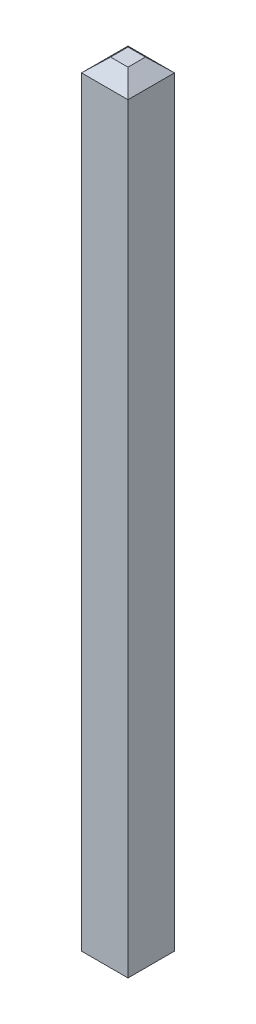
ISO-10303-21;
HEADER;
FILE_DESCRIPTION(('STEP AP214'),'2;1');
FILE_NAME('part.step','',(''),(''),'','','');
FILE_SCHEMA(('AUTOMOTIVE_DESIGN { 1 0 10303 214 1 1 1 1 }'));
ENDSEC;
DATA;
#1=APPLICATION_CONTEXT('core data for automotive mechanical design processes');
#2=APPLICATION_PROTOCOL_DEFINITION('international standard','automotive_design',2000,#1);
#3=PRODUCT_CONTEXT('',#1,'mechanical');
#4=PRODUCT('Part','Part','',(#3));
#5=PRODUCT_RELATED_PRODUCT_CATEGORY('part','',(#4));
#6=PRODUCT_DEFINITION_FORMATION('','',#4);
#7=PRODUCT_DEFINITION_CONTEXT('part definition',#1,'design');
#8=PRODUCT_DEFINITION('design','',#6,#7);
#9=PRODUCT_DEFINITION_SHAPE('','',#8);
#10=(LENGTH_UNIT() NAMED_UNIT(*) SI_UNIT(.MILLI.,.METRE.));
#11=(NAMED_UNIT(*) PLANE_ANGLE_UNIT() SI_UNIT($,.RADIAN.));
#12=(NAMED_UNIT(*) SI_UNIT($,.STERADIAN.) SOLID_ANGLE_UNIT());
#13=UNCERTAINTY_MEASURE_WITH_UNIT(LENGTH_MEASURE(1.E-05),#10,'distance_accuracy_value','');
#14=(GEOMETRIC_REPRESENTATION_CONTEXT(3) GLOBAL_UNCERTAINTY_ASSIGNED_CONTEXT((#13)) GLOBAL_UNIT_ASSIGNED_CONTEXT((#10,
#11,#12)) REPRESENTATION_CONTEXT('',''));
#15=CARTESIAN_POINT('',(0.,0.,0.));
#16=DIRECTION('',(0.,0.,1.));
#17=DIRECTION('',(1.,0.,0.));
#18=AXIS2_PLACEMENT_3D('',#15,#16,#17);
#19=CARTESIAN_POINT('',(5.24480000000001,-7.93710700303773,0.564535931288104));
#20=DIRECTION('',(0.,-0.728753063627172,-0.684776585649664));
#21=DIRECTION('',(0.,0.684776585649664,-0.728753063627172));
#22=AXIS2_PLACEMENT_3D('',#19,#20,#21);
#23=PLANE('',#22);
#24=DIRECTION('',(0.58895390545921,0.553413583578044,-0.588953905459206));
#25=VECTOR('',#24,1.);
#26=CARTESIAN_POINT('',(6.35000000000002,-8.54362065381016,1.21));
#27=LINE('',#26,#25);
#28=CARTESIAN_POINT('',(6.35000000000001,-8.54362065381015,1.21000000000001));
#29=VERTEX_POINT('',#28);
#30=CARTESIAN_POINT('',(6.55000000000001,-8.35568961932738,1.01000000000001));
#31=VERTEX_POINT('',#30);
#32=EDGE_CURVE('E92',#29,#31,#27,.T.);
#33=ORIENTED_EDGE('',*,*,#32,.F.);
#34=DIRECTION('',(1.,0.,0.));
#35=VECTOR('',#34,1.);
#36=CARTESIAN_POINT('',(6.9752,-8.54362065381015,1.21));
#37=LINE('',#36,#35);
#38=CARTESIAN_POINT('',(6.11000000000001,-8.54362065381014,1.21));
#39=VERTEX_POINT('',#38);
#40=EDGE_CURVE('E79',#39,#29,#37,.T.);
#41=ORIENTED_EDGE('',*,*,#40,.F.);
#42=DIRECTION('',(0.588953905459204,-0.553413583578044,0.588953905459212));
#43=VECTOR('',#42,1.);
#44=CARTESIAN_POINT('',(5.91000000000002,-8.35568961932738,1.01));
#45=LINE('',#44,#43);
#46=CARTESIAN_POINT('',(5.91000000000001,-8.35568961932738,1.01000000000001));
#47=VERTEX_POINT('',#46);
#48=EDGE_CURVE('E20',#47,#39,#45,.T.);
#49=ORIENTED_EDGE('',*,*,#48,.F.);
#50=DIRECTION('',(-1.,0.,0.));
#51=VECTOR('',#50,1.);
#52=CARTESIAN_POINT('',(7.2152,-8.35568961932739,1.01));
#53=LINE('',#52,#51);
#54=EDGE_CURVE('E103',#31,#47,#53,.T.);
#55=ORIENTED_EDGE('',*,*,#54,.F.);
#56=EDGE_LOOP('',(#33,#41,#49,#55));
#57=FACE_BOUND('',#56,.T.);
#58=ADVANCED_FACE('F17',(#57),#23,.T.);
#59=CARTESIAN_POINT('',(5.24480000000001,2.7185826521347,1.6554640687119));
#60=DIRECTION('',(0.,0.728753063627171,-0.684776585649664));
#61=DIRECTION('',(0.,0.684776585649664,0.728753063627171));
#62=AXIS2_PLACEMENT_3D('',#59,#60,#61);
#63=PLANE('',#62);
#64=DIRECTION('',(-0.588953905459174,-0.553413583578013,-0.588953905459272));
#65=VECTOR('',#64,1.);
#66=CARTESIAN_POINT('',(6.11000000000001,2.30000003584499,1.21));
#67=LINE('',#66,#65);
#68=CARTESIAN_POINT('',(6.11,2.30000003584502,1.20999999999998));
#69=VERTEX_POINT('',#68);
#70=CARTESIAN_POINT('',(5.91000000000002,2.11206900136229,1.01));
#71=VERTEX_POINT('',#70);
#72=EDGE_CURVE('E108',#69,#71,#67,.T.);
#73=ORIENTED_EDGE('',*,*,#72,.F.);
#74=DIRECTION('',(1.,0.,0.));
#75=VECTOR('',#74,1.);
#76=CARTESIAN_POINT('',(6.9752,2.300000035845,1.21));
#77=LINE('',#76,#75);
#78=CARTESIAN_POINT('',(6.35000000000003,2.30000003584503,1.20999999999999));
#79=VERTEX_POINT('',#78);
#80=EDGE_CURVE('E116',#79,#69,#77,.F.);
#81=ORIENTED_EDGE('',*,*,#80,.F.);
#82=DIRECTION('',(-0.588953905459178,0.553413583578018,0.588953905459263));
#83=VECTOR('',#82,1.);
#84=CARTESIAN_POINT('',(6.55000000000002,2.11206900136231,1.01));
#85=LINE('',#84,#83);
#86=CARTESIAN_POINT('',(6.55000000000001,2.11206900136231,1.01));
#87=VERTEX_POINT('',#86);
#88=EDGE_CURVE('E111',#87,#79,#85,.T.);
#89=ORIENTED_EDGE('',*,*,#88,.F.);
#90=DIRECTION('',(-1.,0.,0.));
#91=VECTOR('',#90,1.);
#92=CARTESIAN_POINT('',(7.2152,2.1120690013623,1.01));
#93=LINE('',#92,#91);
#94=EDGE_CURVE('E105',#71,#87,#93,.F.);
#95=ORIENTED_EDGE('',*,*,#94,.F.);
#96=EDGE_LOOP('',(#73,#81,#89,#95));
#97=FACE_BOUND('',#96,.T.);
#98=ADVANCED_FACE('F176',(#97),#63,.T.);
#99=CARTESIAN_POINT('',(5.46453593128811,-7.93710700303774,0.344800000000003));
#100=DIRECTION('',(-0.684776585649664,-0.728753063627171,0.));
#101=DIRECTION('',(0.728753063627171,-0.684776585649664,0.));
#102=AXIS2_PLACEMENT_3D('',#99,#100,#101);
#103=PLANE('',#102);
#104=DIRECTION('',(0.,0.,-1.));
#105=VECTOR('',#104,1.);
#106=CARTESIAN_POINT('',(6.11,-8.54362065381015,0.584800000000003));
#107=LINE('',#106,#105);
#108=CARTESIAN_POINT('',(6.11000000000001,-8.54362065381014,1.45));
#109=VERTEX_POINT('',#108);
#110=EDGE_CURVE('E85',#109,#39,#107,.T.);
#111=ORIENTED_EDGE('',*,*,#110,.F.);
#112=DIRECTION('',(0.588953905459186,-0.553413583578055,-0.588953905459219));
#113=VECTOR('',#112,1.);
#114=CARTESIAN_POINT('',(5.91000000000001,-8.3556896193274,1.65000000000001));
#115=LINE('',#114,#113);
#116=CARTESIAN_POINT('',(5.91000000000002,-8.35568961932738,1.65));
#117=VERTEX_POINT('',#116);
#118=EDGE_CURVE('E132',#117,#109,#115,.T.);
#119=ORIENTED_EDGE('',*,*,#118,.F.);
#120=DIRECTION('',(0.,0.,1.));
#121=VECTOR('',#120,1.);
#122=CARTESIAN_POINT('',(5.91000000000001,-8.35568961932739,2.3152));
#123=LINE('',#122,#121);
#124=EDGE_CURVE('E88',#47,#117,#123,.T.);
#125=ORIENTED_EDGE('',*,*,#124,.F.);
#126=ORIENTED_EDGE('',*,*,#48,.T.);
#127=EDGE_LOOP('',(#111,#119,#125,#126));
#128=FACE_BOUND('',#127,.T.);
#129=ADVANCED_FACE('F84',(#128),#103,.T.);
#130=CARTESIAN_POINT('',(6.9752,-8.54362065381015,0.584800000000003));
#131=DIRECTION('',(0.,-1.,0.));
#132=DIRECTION('',(0.,0.,-1.));
#133=AXIS2_PLACEMENT_3D('',#130,#131,#132);
#134=PLANE('',#133);
#135=ORIENTED_EDGE('',*,*,#110,.T.);
#136=ORIENTED_EDGE('',*,*,#40,.T.);
#137=DIRECTION('',(0.,0.,1.));
#138=VECTOR('',#137,1.);
#139=CARTESIAN_POINT('',(6.35000000000002,-8.54362065381016,0.344800000000003));
#140=LINE('',#139,#138);
#141=CARTESIAN_POINT('',(6.35000000000002,-8.54362065381016,1.45));
#142=VERTEX_POINT('',#141);
#143=EDGE_CURVE('E94',#142,#29,#140,.F.);
#144=ORIENTED_EDGE('',*,*,#143,.F.);
#145=DIRECTION('',(1.,0.,0.));
#146=VECTOR('',#145,1.);
#147=CARTESIAN_POINT('',(5.24480000000001,-8.54362065381016,1.45000000000001));
#148=LINE('',#147,#146);
#149=EDGE_CURVE('E98',#109,#142,#148,.T.);
#150=ORIENTED_EDGE('',*,*,#149,.F.);
#151=EDGE_LOOP('',(#135,#136,#144,#150));
#152=FACE_BOUND('',#151,.T.);
#153=ADVANCED_FACE('F96',(#152),#134,.T.);
#154=CARTESIAN_POINT('',(5.90453593128811,-8.9622032700998,0.344800000000003));
#155=DIRECTION('',(0.684776585649664,-0.728753063627171,0.));
#156=DIRECTION('',(0.728753063627171,0.684776585649664,0.));
#157=AXIS2_PLACEMENT_3D('',#154,#155,#156);
#158=PLANE('',#157);
#159=DIRECTION('',(0.,0.,-1.));
#160=VECTOR('',#159,1.);
#161=CARTESIAN_POINT('',(6.55000000000001,-8.35568961932739,2.3152));
#162=LINE('',#161,#160);
#163=CARTESIAN_POINT('',(6.55000000000002,-8.3556896193274,1.65));
#164=VERTEX_POINT('',#163);
#165=EDGE_CURVE('E135',#164,#31,#162,.T.);
#166=ORIENTED_EDGE('',*,*,#165,.F.);
#167=DIRECTION('',(0.588953905459204,0.553413583578046,0.58895390545921));
#168=VECTOR('',#167,1.);
#169=CARTESIAN_POINT('',(6.35000000000001,-8.54362065381016,1.45000000000001));
#170=LINE('',#169,#168);
#171=EDGE_CURVE('E129',#142,#164,#170,.T.);
#172=ORIENTED_EDGE('',*,*,#171,.F.);
#173=ORIENTED_EDGE('',*,*,#143,.T.);
#174=ORIENTED_EDGE('',*,*,#32,.T.);
#175=EDGE_LOOP('',(#166,#172,#173,#174));
#176=FACE_BOUND('',#175,.T.);
#177=ADVANCED_FACE('F186',(#176),#158,.T.);
#178=CARTESIAN_POINT('',(7.2152,3.1599724496381,1.01));
#179=DIRECTION('',(0.,0.,-1.));
#180=DIRECTION('',(-1.,0.,0.));
#181=AXIS2_PLACEMENT_3D('',#178,#179,#180);
#182=PLANE('',#181);
#183=DIRECTION('',(0.,1.,0.));
#184=VECTOR('',#183,1.);
#185=CARTESIAN_POINT('',(5.91000000000001,3.1599724496381,1.01));
#186=LINE('',#185,#184);
#187=EDGE_CURVE('E126',#71,#47,#186,.F.);
#188=ORIENTED_EDGE('',*,*,#187,.F.);
#189=ORIENTED_EDGE('',*,*,#94,.T.);
#190=DIRECTION('',(0.,1.,0.));
#191=VECTOR('',#190,1.);
#192=CARTESIAN_POINT('',(6.55000000000001,-9.40359306760325,1.01));
#193=LINE('',#192,#191);
#194=EDGE_CURVE('E138',#31,#87,#193,.T.);
#195=ORIENTED_EDGE('',*,*,#194,.F.);
#196=ORIENTED_EDGE('',*,*,#54,.T.);
#197=EDGE_LOOP('',(#188,#189,#195,#196));
#198=FACE_BOUND('',#197,.T.);
#199=ADVANCED_FACE('F179',(#198),#182,.T.);
#200=CARTESIAN_POINT('',(5.46453593128811,1.6934863850726,2.3152));
#201=DIRECTION('',(-0.684776585649665,0.72875306362717,0.));
#202=DIRECTION('',(-0.72875306362717,-0.684776585649665,0.));
#203=AXIS2_PLACEMENT_3D('',#200,#201,#202);
#204=PLANE('',#203);
#205=DIRECTION('',(0.,0.,1.));
#206=VECTOR('',#205,1.);
#207=CARTESIAN_POINT('',(6.11,2.300000035845,2.0752));
#208=LINE('',#207,#206);
#209=CARTESIAN_POINT('',(6.11000000000001,2.30000003584499,1.45));
#210=VERTEX_POINT('',#209);
#211=EDGE_CURVE('E119',#69,#210,#208,.T.);
#212=ORIENTED_EDGE('',*,*,#211,.F.);
#213=ORIENTED_EDGE('',*,*,#72,.T.);
#214=DIRECTION('',(0.,0.,1.));
#215=VECTOR('',#214,1.);
#216=CARTESIAN_POINT('',(5.91000000000001,2.1120690013623,2.3152));
#217=LINE('',#216,#215);
#218=CARTESIAN_POINT('',(5.91000000000003,2.11206900136228,1.65));
#219=VERTEX_POINT('',#218);
#220=EDGE_CURVE('E123',#219,#71,#217,.F.);
#221=ORIENTED_EDGE('',*,*,#220,.F.);
#222=DIRECTION('',(-0.588953905459245,-0.553413583578025,0.588953905459189));
#223=VECTOR('',#222,1.);
#224=CARTESIAN_POINT('',(6.11,2.30000003584499,1.44999999999999));
#225=LINE('',#224,#223);
#226=EDGE_CURVE('E143',#210,#219,#225,.T.);
#227=ORIENTED_EDGE('',*,*,#226,.F.);
#228=EDGE_LOOP('',(#212,#213,#221,#227));
#229=FACE_BOUND('',#228,.T.);
#230=ADVANCED_FACE('F170',(#229),#204,.T.);
#231=CARTESIAN_POINT('',(5.90453593128811,2.7185826521347,2.3152));
#232=DIRECTION('',(0.684776585649666,0.72875306362717,0.));
#233=DIRECTION('',(-0.72875306362717,0.684776585649666,0.));
#234=AXIS2_PLACEMENT_3D('',#231,#232,#233);
#235=PLANE('',#234);
#236=DIRECTION('',(0.,0.,-1.));
#237=VECTOR('',#236,1.);
#238=CARTESIAN_POINT('',(6.55000000000001,2.1120690013623,2.3152));
#239=LINE('',#238,#237);
#240=CARTESIAN_POINT('',(6.55000000000001,2.1120690013623,1.65));
#241=VERTEX_POINT('',#240);
#242=EDGE_CURVE('E141',#87,#241,#239,.F.);
#243=ORIENTED_EDGE('',*,*,#242,.F.);
#244=ORIENTED_EDGE('',*,*,#88,.T.);
#245=DIRECTION('',(0.,0.,1.));
#246=VECTOR('',#245,1.);
#247=CARTESIAN_POINT('',(6.35000000000001,2.300000035845,2.0752));
#248=LINE('',#247,#246);
#249=CARTESIAN_POINT('',(6.35000000000003,2.30000003584502,1.45));
#250=VERTEX_POINT('',#249);
#251=EDGE_CURVE('E113',#250,#79,#248,.F.);
#252=ORIENTED_EDGE('',*,*,#251,.F.);
#253=DIRECTION('',(-0.588953905459263,0.553413583578016,-0.588953905459179));
#254=VECTOR('',#253,1.);
#255=CARTESIAN_POINT('',(6.55000000000001,2.11206900136226,1.64999999999996));
#256=LINE('',#255,#254);
#257=EDGE_CURVE('E35',#241,#250,#256,.T.);
#258=ORIENTED_EDGE('',*,*,#257,.F.);
#259=EDGE_LOOP('',(#243,#244,#252,#258));
#260=FACE_BOUND('',#259,.T.);
#261=ADVANCED_FACE('F211',(#260),#235,.T.);
#262=CARTESIAN_POINT('',(6.9752,2.300000035845,2.0752));
#263=DIRECTION('',(0.,1.,0.));
#264=DIRECTION('',(0.,0.,1.));
#265=AXIS2_PLACEMENT_3D('',#262,#263,#264);
#266=PLANE('',#265);
#267=ORIENTED_EDGE('',*,*,#211,.T.);
#268=DIRECTION('',(1.,0.,0.));
#269=VECTOR('',#268,1.);
#270=CARTESIAN_POINT('',(5.24480000000001,2.30000003584499,1.44999999999999));
#271=LINE('',#270,#269);
#272=EDGE_CURVE('E147',#250,#210,#271,.F.);
#273=ORIENTED_EDGE('',*,*,#272,.F.);
#274=ORIENTED_EDGE('',*,*,#251,.T.);
#275=ORIENTED_EDGE('',*,*,#80,.T.);
#276=EDGE_LOOP('',(#267,#273,#274,#275));
#277=FACE_BOUND('',#276,.T.);
#278=ADVANCED_FACE('F173',(#277),#266,.T.);
#279=CARTESIAN_POINT('',(5.91000000000001,3.1599724496381,2.3152));
#280=DIRECTION('',(-1.,0.,0.));
#281=DIRECTION('',(0.,0.,1.));
#282=AXIS2_PLACEMENT_3D('',#279,#280,#281);
#283=PLANE('',#282);
#284=ORIENTED_EDGE('',*,*,#220,.T.);
#285=ORIENTED_EDGE('',*,*,#187,.T.);
#286=ORIENTED_EDGE('',*,*,#124,.T.);
#287=DIRECTION('',(0.,1.,0.));
#288=VECTOR('',#287,1.);
#289=CARTESIAN_POINT('',(5.91000000000001,-9.40359306760325,1.65));
#290=LINE('',#289,#288);
#291=EDGE_CURVE('E150',#219,#117,#290,.F.);
#292=ORIENTED_EDGE('',*,*,#291,.F.);
#293=EDGE_LOOP('',(#284,#285,#286,#292));
#294=FACE_BOUND('',#293,.T.);
#295=ADVANCED_FACE('F181',(#294),#283,.T.);
#296=CARTESIAN_POINT('',(5.24480000000001,-8.9622032700998,1.0045359312881));
#297=DIRECTION('',(0.,-0.728753063627172,0.684776585649664));
#298=DIRECTION('',(0.,-0.684776585649664,-0.728753063627172));
#299=AXIS2_PLACEMENT_3D('',#296,#297,#298);
#300=PLANE('',#299);
#301=ORIENTED_EDGE('',*,*,#118,.T.);
#302=ORIENTED_EDGE('',*,*,#149,.T.);
#303=ORIENTED_EDGE('',*,*,#171,.T.);
#304=DIRECTION('',(1.,0.,0.));
#305=VECTOR('',#304,1.);
#306=CARTESIAN_POINT('',(7.2152,-8.35568961932739,1.65));
#307=LINE('',#306,#305);
#308=EDGE_CURVE('E153',#117,#164,#307,.T.);
#309=ORIENTED_EDGE('',*,*,#308,.F.);
#310=EDGE_LOOP('',(#301,#302,#303,#309));
#311=FACE_BOUND('',#310,.T.);
#312=ADVANCED_FACE('F183',(#311),#300,.T.);
#313=CARTESIAN_POINT('',(6.55000000000001,-9.40359306760325,2.3152));
#314=DIRECTION('',(1.,0.,0.));
#315=DIRECTION('',(0.,0.,-1.));
#316=AXIS2_PLACEMENT_3D('',#313,#314,#315);
#317=PLANE('',#316);
#318=ORIENTED_EDGE('',*,*,#242,.T.);
#319=DIRECTION('',(0.,1.,0.));
#320=VECTOR('',#319,1.);
#321=CARTESIAN_POINT('',(6.55000000000001,-9.40359306760325,1.65));
#322=LINE('',#321,#320);
#323=EDGE_CURVE('E26',#164,#241,#322,.T.);
#324=ORIENTED_EDGE('',*,*,#323,.F.);
#325=ORIENTED_EDGE('',*,*,#165,.T.);
#326=ORIENTED_EDGE('',*,*,#194,.T.);
#327=EDGE_LOOP('',(#318,#324,#325,#326));
#328=FACE_BOUND('',#327,.T.);
#329=ADVANCED_FACE('F163',(#328),#317,.T.);
#330=CARTESIAN_POINT('',(5.24480000000001,1.6934863850726,2.0954640687119));
#331=DIRECTION('',(0.,0.728753063627172,0.684776585649663));
#332=DIRECTION('',(0.,-0.684776585649663,0.728753063627172));
#333=AXIS2_PLACEMENT_3D('',#330,#331,#332);
#334=PLANE('',#333);
#335=ORIENTED_EDGE('',*,*,#257,.T.);
#336=ORIENTED_EDGE('',*,*,#272,.T.);
#337=ORIENTED_EDGE('',*,*,#226,.T.);
#338=DIRECTION('',(1.,0.,0.));
#339=VECTOR('',#338,1.);
#340=CARTESIAN_POINT('',(7.2152,2.1120690013623,1.65));
#341=LINE('',#340,#339);
#342=EDGE_CURVE('E11',#241,#219,#341,.F.);
#343=ORIENTED_EDGE('',*,*,#342,.F.);
#344=EDGE_LOOP('',(#335,#336,#337,#343));
#345=FACE_BOUND('',#344,.T.);
#346=ADVANCED_FACE('F166',(#345),#334,.T.);
#347=CARTESIAN_POINT('',(7.2152,-9.40359306760325,1.65));
#348=DIRECTION('',(0.,0.,1.));
#349=DIRECTION('',(1.,0.,0.));
#350=AXIS2_PLACEMENT_3D('',#347,#348,#349);
#351=PLANE('',#350);
#352=ORIENTED_EDGE('',*,*,#323,.T.);
#353=ORIENTED_EDGE('',*,*,#342,.T.);
#354=ORIENTED_EDGE('',*,*,#291,.T.);
#355=ORIENTED_EDGE('',*,*,#308,.T.);
#356=EDGE_LOOP('',(#352,#353,#354,#355));
#357=FACE_BOUND('',#356,.T.);
#358=ADVANCED_FACE('F159',(#357),#351,.T.);
#359=CLOSED_SHELL('',(#58,#98,#129,#153,#177,#199,#230,#261,#278,#295,#312,#329,#346,#358));
#360=MANIFOLD_SOLID_BREP('B1',#359);
#361=ADVANCED_BREP_SHAPE_REPRESENTATION('',(#18,#360),#14);
#362=SHAPE_DEFINITION_REPRESENTATION(#9,#361);
ENDSEC;
END-ISO-10303-21;
